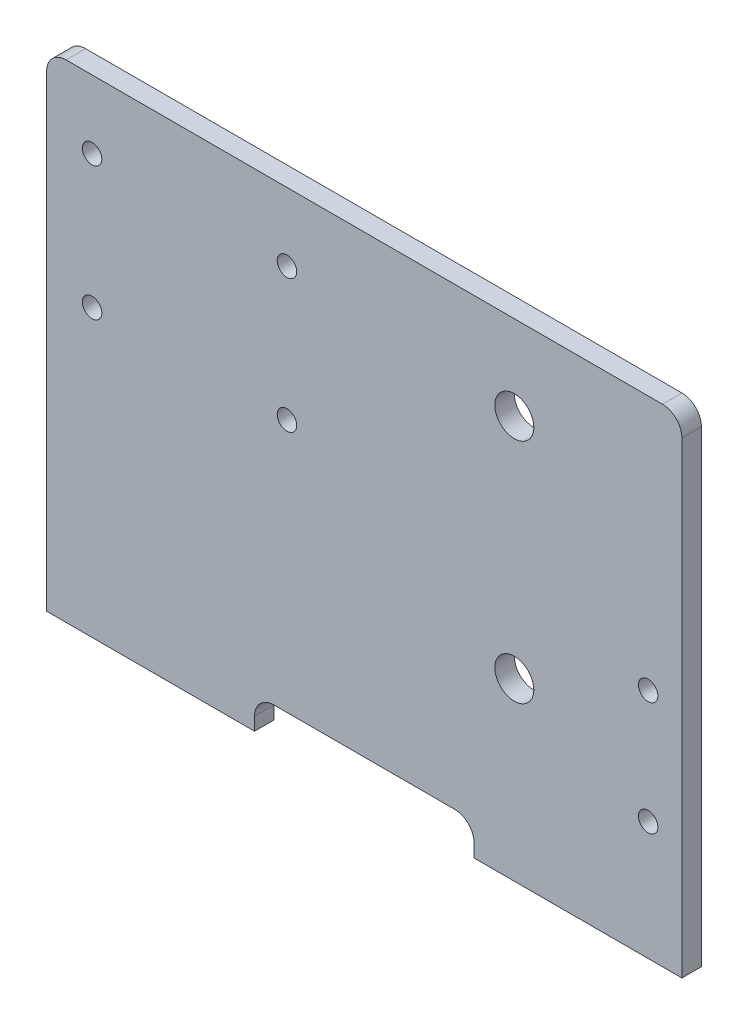
ISO-10303-21;
HEADER;
FILE_DESCRIPTION(('STEP AP214'),'2;1');
FILE_NAME('part.step','',(''),(''),'','','');
FILE_SCHEMA(('AUTOMOTIVE_DESIGN { 1 0 10303 214 1 1 1 1 }'));
ENDSEC;
DATA;
#1=APPLICATION_CONTEXT('core data for automotive mechanical design processes');
#2=APPLICATION_PROTOCOL_DEFINITION('international standard','automotive_design',2000,#1);
#3=PRODUCT_CONTEXT('',#1,'mechanical');
#4=PRODUCT('Part','Part','',(#3));
#5=PRODUCT_RELATED_PRODUCT_CATEGORY('part','',(#4));
#6=PRODUCT_DEFINITION_FORMATION('','',#4);
#7=PRODUCT_DEFINITION_CONTEXT('part definition',#1,'design');
#8=PRODUCT_DEFINITION('design','',#6,#7);
#9=PRODUCT_DEFINITION_SHAPE('','',#8);
#10=(LENGTH_UNIT() NAMED_UNIT(*) SI_UNIT(.MILLI.,.METRE.));
#11=(NAMED_UNIT(*) PLANE_ANGLE_UNIT() SI_UNIT($,.RADIAN.));
#12=(NAMED_UNIT(*) SI_UNIT($,.STERADIAN.) SOLID_ANGLE_UNIT());
#13=UNCERTAINTY_MEASURE_WITH_UNIT(LENGTH_MEASURE(1.E-05),#10,'distance_accuracy_value','');
#14=(GEOMETRIC_REPRESENTATION_CONTEXT(3) GLOBAL_UNCERTAINTY_ASSIGNED_CONTEXT((#13)) GLOBAL_UNIT_ASSIGNED_CONTEXT((#10,
#11,#12)) REPRESENTATION_CONTEXT('',''));
#15=CARTESIAN_POINT('',(0.,0.,0.));
#16=DIRECTION('',(0.,0.,1.));
#17=DIRECTION('',(1.,0.,0.));
#18=AXIS2_PLACEMENT_3D('',#15,#16,#17);
#19=CARTESIAN_POINT('',(-48.9,-37.5,1.5));
#20=DIRECTION('',(0.,1.,0.));
#21=DIRECTION('',(0.,0.,1.));
#22=AXIS2_PLACEMENT_3D('',#19,#20,#21);
#23=PLANE('',#22);
#24=DIRECTION('',(1.,0.,0.));
#25=VECTOR('',#24,1.);
#26=CARTESIAN_POINT('',(-48.9,-37.5,1.5));
#27=LINE('',#26,#25);
#28=CARTESIAN_POINT('',(16.9,-37.5,1.5));
#29=VERTEX_POINT('',#28);
#30=CARTESIAN_POINT('',(48.9,-37.5,1.5));
#31=VERTEX_POINT('',#30);
#32=EDGE_CURVE('E270',#29,#31,#27,.T.);
#33=ORIENTED_EDGE('',*,*,#32,.F.);
#34=DIRECTION('',(0.,0.,1.));
#35=VECTOR('',#34,1.);
#36=CARTESIAN_POINT('',(16.9,-37.5,-1.5));
#37=LINE('',#36,#35);
#38=CARTESIAN_POINT('',(16.9,-37.5,-1.5));
#39=VERTEX_POINT('',#38);
#40=EDGE_CURVE('E155',#39,#29,#37,.T.);
#41=ORIENTED_EDGE('',*,*,#40,.F.);
#42=DIRECTION('',(1.,0.,0.));
#43=VECTOR('',#42,1.);
#44=CARTESIAN_POINT('',(-48.9,-37.5,-1.5));
#45=LINE('',#44,#43);
#46=CARTESIAN_POINT('',(48.9,-37.5,-1.5));
#47=VERTEX_POINT('',#46);
#48=EDGE_CURVE('E162',#39,#47,#45,.T.);
#49=ORIENTED_EDGE('',*,*,#48,.T.);
#50=DIRECTION('',(0.,0.,-1.));
#51=VECTOR('',#50,1.);
#52=CARTESIAN_POINT('',(48.9,-37.5,1.5));
#53=LINE('',#52,#51);
#54=EDGE_CURVE('E170',#31,#47,#53,.T.);
#55=ORIENTED_EDGE('',*,*,#54,.F.);
#56=EDGE_LOOP('',(#33,#41,#49,#55));
#57=FACE_BOUND('',#56,.T.);
#58=ADVANCED_FACE('F45',(#57),#23,.F.);
#59=CARTESIAN_POINT('',(0.,0.,1.5));
#60=DIRECTION('',(0.,0.,1.));
#61=DIRECTION('',(1.,0.,0.));
#62=AXIS2_PLACEMENT_3D('',#59,#60,#61);
#63=PLANE('',#62);
#64=DIRECTION('',(-1.,0.,0.));
#65=VECTOR('',#64,1.);
#66=CARTESIAN_POINT('',(-48.9,37.5,1.5));
#67=LINE('',#66,#65);
#68=CARTESIAN_POINT('',(45.9,37.5,1.5));
#69=VERTEX_POINT('',#68);
#70=CARTESIAN_POINT('',(-45.9,37.5,1.5));
#71=VERTEX_POINT('',#70);
#72=EDGE_CURVE('E164',#69,#71,#67,.T.);
#73=ORIENTED_EDGE('',*,*,#72,.T.);
#74=CARTESIAN_POINT('',(-45.9,34.5,1.5));
#75=DIRECTION('',(0.,0.,1.));
#76=DIRECTION('',(1.,0.,0.));
#77=AXIS2_PLACEMENT_3D('',#74,#75,#76);
#78=CIRCLE('',#77,3.);
#79=CARTESIAN_POINT('',(-48.9,34.5,1.5));
#80=VERTEX_POINT('',#79);
#81=EDGE_CURVE('E196',#71,#80,#78,.T.);
#82=ORIENTED_EDGE('',*,*,#81,.T.);
#83=DIRECTION('',(0.,-1.,0.));
#84=VECTOR('',#83,1.);
#85=CARTESIAN_POINT('',(-48.9,37.5,1.5));
#86=LINE('',#85,#84);
#87=CARTESIAN_POINT('',(-48.9,-37.5,1.5));
#88=VERTEX_POINT('',#87);
#89=EDGE_CURVE('E268',#80,#88,#86,.T.);
#90=ORIENTED_EDGE('',*,*,#89,.T.);
#91=CARTESIAN_POINT('',(-16.9,-37.5,1.5));
#92=VERTEX_POINT('',#91);
#93=EDGE_CURVE('E173',#88,#92,#27,.T.);
#94=ORIENTED_EDGE('',*,*,#93,.T.);
#95=DIRECTION('',(0.,-1.,0.));
#96=VECTOR('',#95,1.);
#97=CARTESIAN_POINT('',(-16.9,-37.5,1.5));
#98=LINE('',#97,#96);
#99=CARTESIAN_POINT('',(-16.9,-35.5,1.5));
#100=VERTEX_POINT('',#99);
#101=EDGE_CURVE('E151',#100,#92,#98,.T.);
#102=ORIENTED_EDGE('',*,*,#101,.F.);
#103=CARTESIAN_POINT('',(-13.9,-35.5,1.5));
#104=DIRECTION('',(0.,0.,1.));
#105=DIRECTION('',(1.,0.,0.));
#106=AXIS2_PLACEMENT_3D('',#103,#104,#105);
#107=CIRCLE('',#106,3.);
#108=CARTESIAN_POINT('',(-13.9,-32.5,1.5));
#109=VERTEX_POINT('',#108);
#110=EDGE_CURVE('E53',#100,#109,#107,.F.);
#111=ORIENTED_EDGE('',*,*,#110,.T.);
#112=DIRECTION('',(-1.,0.,0.));
#113=VECTOR('',#112,1.);
#114=CARTESIAN_POINT('',(16.9,-32.5,1.5));
#115=LINE('',#114,#113);
#116=CARTESIAN_POINT('',(13.9,-32.5,1.5));
#117=VERTEX_POINT('',#116);
#118=EDGE_CURVE('E210',#117,#109,#115,.T.);
#119=ORIENTED_EDGE('',*,*,#118,.F.);
#120=CARTESIAN_POINT('',(13.9,-35.5,1.5));
#121=DIRECTION('',(0.,0.,1.));
#122=DIRECTION('',(1.,0.,0.));
#123=AXIS2_PLACEMENT_3D('',#120,#121,#122);
#124=CIRCLE('',#123,3.);
#125=CARTESIAN_POINT('',(16.9,-35.5,1.5));
#126=VERTEX_POINT('',#125);
#127=EDGE_CURVE('E201',#117,#126,#124,.F.);
#128=ORIENTED_EDGE('',*,*,#127,.T.);
#129=DIRECTION('',(0.,1.,0.));
#130=VECTOR('',#129,1.);
#131=CARTESIAN_POINT('',(16.9,-37.5,1.5));
#132=LINE('',#131,#130);
#133=EDGE_CURVE('E215',#29,#126,#132,.T.);
#134=ORIENTED_EDGE('',*,*,#133,.F.);
#135=ORIENTED_EDGE('',*,*,#32,.T.);
#136=DIRECTION('',(0.,1.,0.));
#137=VECTOR('',#136,1.);
#138=CARTESIAN_POINT('',(48.9,37.5,1.5));
#139=LINE('',#138,#137);
#140=CARTESIAN_POINT('',(48.9,34.5,1.5));
#141=VERTEX_POINT('',#140);
#142=EDGE_CURVE('E161',#31,#141,#139,.T.);
#143=ORIENTED_EDGE('',*,*,#142,.T.);
#144=CARTESIAN_POINT('',(45.9,34.5,1.5));
#145=DIRECTION('',(0.,0.,1.));
#146=DIRECTION('',(1.,0.,0.));
#147=AXIS2_PLACEMENT_3D('',#144,#145,#146);
#148=CIRCLE('',#147,3.);
#149=EDGE_CURVE('E194',#141,#69,#148,.T.);
#150=ORIENTED_EDGE('',*,*,#149,.T.);
#151=EDGE_LOOP('',(#73,#82,#90,#94,#102,#111,#119,#128,#134,#135,#143,#150));
#152=FACE_BOUND('',#151,.T.);
#153=CARTESIAN_POINT('',(43.7,-1.75,1.5));
#154=DIRECTION('',(0.,0.,1.));
#155=DIRECTION('',(1.,0.,0.));
#156=AXIS2_PLACEMENT_3D('',#153,#154,#155);
#157=CIRCLE('',#156,1.5);
#158=CARTESIAN_POINT('',(45.2,-1.75,1.5));
#159=VERTEX_POINT('',#158);
#160=EDGE_CURVE('E307',#159,#159,#157,.T.);
#161=ORIENTED_EDGE('',*,*,#160,.F.);
#162=EDGE_LOOP('',(#161));
#163=FACE_BOUND('',#162,.T.);
#164=CARTESIAN_POINT('',(-41.9,6.5,1.5));
#165=DIRECTION('',(0.,0.,1.));
#166=DIRECTION('',(1.,0.,0.));
#167=AXIS2_PLACEMENT_3D('',#164,#165,#166);
#168=CIRCLE('',#167,1.5);
#169=CARTESIAN_POINT('',(-40.4,6.5,1.5));
#170=VERTEX_POINT('',#169);
#171=EDGE_CURVE('E319',#170,#170,#168,.T.);
#172=ORIENTED_EDGE('',*,*,#171,.F.);
#173=EDGE_LOOP('',(#172));
#174=FACE_BOUND('',#173,.T.);
#175=CARTESIAN_POINT('',(-11.9,27.,1.5));
#176=DIRECTION('',(0.,0.,1.));
#177=DIRECTION('',(1.,0.,0.));
#178=AXIS2_PLACEMENT_3D('',#175,#176,#177);
#179=CIRCLE('',#178,1.5);
#180=CARTESIAN_POINT('',(-10.4,27.,1.5));
#181=VERTEX_POINT('',#180);
#182=EDGE_CURVE('E331',#181,#181,#179,.T.);
#183=ORIENTED_EDGE('',*,*,#182,.F.);
#184=EDGE_LOOP('',(#183));
#185=FACE_BOUND('',#184,.T.);
#186=CARTESIAN_POINT('',(-41.9,27.,1.5));
#187=DIRECTION('',(0.,0.,1.));
#188=DIRECTION('',(1.,0.,0.));
#189=AXIS2_PLACEMENT_3D('',#186,#187,#188);
#190=CIRCLE('',#189,1.5);
#191=CARTESIAN_POINT('',(-40.4,27.,1.5));
#192=VERTEX_POINT('',#191);
#193=EDGE_CURVE('E277',#192,#192,#190,.T.);
#194=ORIENTED_EDGE('',*,*,#193,.F.);
#195=EDGE_LOOP('',(#194));
#196=FACE_BOUND('',#195,.T.);
#197=CARTESIAN_POINT('',(23.1,-10.5,1.5));
#198=DIRECTION('',(0.,0.,1.));
#199=DIRECTION('',(1.,0.,0.));
#200=AXIS2_PLACEMENT_3D('',#197,#198,#199);
#201=CIRCLE('',#200,3.);
#202=CARTESIAN_POINT('',(26.1,-10.5,1.5));
#203=VERTEX_POINT('',#202);
#204=EDGE_CURVE('E337',#203,#203,#201,.T.);
#205=ORIENTED_EDGE('',*,*,#204,.F.);
#206=EDGE_LOOP('',(#205));
#207=FACE_BOUND('',#206,.T.);
#208=CARTESIAN_POINT('',(-11.8999999999998,6.5,1.5));
#209=DIRECTION('',(0.,0.,1.));
#210=DIRECTION('',(1.,0.,0.));
#211=AXIS2_PLACEMENT_3D('',#208,#209,#210);
#212=CIRCLE('',#211,1.5);
#213=CARTESIAN_POINT('',(-10.3999999999998,6.5,1.5));
#214=VERTEX_POINT('',#213);
#215=EDGE_CURVE('E325',#214,#214,#212,.T.);
#216=ORIENTED_EDGE('',*,*,#215,.F.);
#217=EDGE_LOOP('',(#216));
#218=FACE_BOUND('',#217,.T.);
#219=CARTESIAN_POINT('',(23.1,24.5,1.5));
#220=DIRECTION('',(0.,0.,1.));
#221=DIRECTION('',(1.,0.,0.));
#222=AXIS2_PLACEMENT_3D('',#219,#220,#221);
#223=CIRCLE('',#222,3.);
#224=CARTESIAN_POINT('',(26.1,24.5,1.5));
#225=VERTEX_POINT('',#224);
#226=EDGE_CURVE('E313',#225,#225,#223,.T.);
#227=ORIENTED_EDGE('',*,*,#226,.F.);
#228=EDGE_LOOP('',(#227));
#229=FACE_BOUND('',#228,.T.);
#230=CARTESIAN_POINT('',(43.7,-19.25,1.5));
#231=DIRECTION('',(0.,0.,1.));
#232=DIRECTION('',(1.,0.,0.));
#233=AXIS2_PLACEMENT_3D('',#230,#231,#232);
#234=CIRCLE('',#233,1.5);
#235=CARTESIAN_POINT('',(45.2,-19.25,1.5));
#236=VERTEX_POINT('',#235);
#237=EDGE_CURVE('E301',#236,#236,#234,.T.);
#238=ORIENTED_EDGE('',*,*,#237,.F.);
#239=EDGE_LOOP('',(#238));
#240=FACE_BOUND('',#239,.T.);
#241=ADVANCED_FACE('F208',(#152,#163,#174,#185,#196,#207,#218,#229,#240),#63,.T.);
#242=CARTESIAN_POINT('',(0.,0.,-1.5));
#243=DIRECTION('',(0.,0.,1.));
#244=DIRECTION('',(1.,0.,0.));
#245=AXIS2_PLACEMENT_3D('',#242,#243,#244);
#246=PLANE('',#245);
#247=DIRECTION('',(0.,-1.,0.));
#248=VECTOR('',#247,1.);
#249=CARTESIAN_POINT('',(-48.9,37.5,-1.5));
#250=LINE('',#249,#248);
#251=CARTESIAN_POINT('',(-48.9,34.5,-1.5));
#252=VERTEX_POINT('',#251);
#253=CARTESIAN_POINT('',(-48.9,-37.5,-1.5));
#254=VERTEX_POINT('',#253);
#255=EDGE_CURVE('E166',#252,#254,#250,.T.);
#256=ORIENTED_EDGE('',*,*,#255,.F.);
#257=CARTESIAN_POINT('',(-45.9,34.5,-1.5));
#258=DIRECTION('',(0.,0.,1.));
#259=DIRECTION('',(1.,0.,0.));
#260=AXIS2_PLACEMENT_3D('',#257,#258,#259);
#261=CIRCLE('',#260,3.);
#262=CARTESIAN_POINT('',(-45.9,37.5,-1.5));
#263=VERTEX_POINT('',#262);
#264=EDGE_CURVE('E187',#252,#263,#261,.F.);
#265=ORIENTED_EDGE('',*,*,#264,.T.);
#266=DIRECTION('',(-1.,0.,0.));
#267=VECTOR('',#266,1.);
#268=CARTESIAN_POINT('',(-48.9,37.5,-1.5));
#269=LINE('',#268,#267);
#270=CARTESIAN_POINT('',(45.9,37.5,-1.5));
#271=VERTEX_POINT('',#270);
#272=EDGE_CURVE('E276',#271,#263,#269,.T.);
#273=ORIENTED_EDGE('',*,*,#272,.F.);
#274=CARTESIAN_POINT('',(45.9,34.5,-1.5));
#275=DIRECTION('',(0.,0.,1.));
#276=DIRECTION('',(1.,0.,0.));
#277=AXIS2_PLACEMENT_3D('',#274,#275,#276);
#278=CIRCLE('',#277,3.);
#279=CARTESIAN_POINT('',(48.9,34.5,-1.5));
#280=VERTEX_POINT('',#279);
#281=EDGE_CURVE('E185',#271,#280,#278,.F.);
#282=ORIENTED_EDGE('',*,*,#281,.T.);
#283=DIRECTION('',(0.,1.,0.));
#284=VECTOR('',#283,1.);
#285=CARTESIAN_POINT('',(48.9,37.5,-1.5));
#286=LINE('',#285,#284);
#287=EDGE_CURVE('E275',#47,#280,#286,.T.);
#288=ORIENTED_EDGE('',*,*,#287,.F.);
#289=ORIENTED_EDGE('',*,*,#48,.F.);
#290=DIRECTION('',(0.,1.,0.));
#291=VECTOR('',#290,1.);
#292=CARTESIAN_POINT('',(16.9,-37.5,-1.5));
#293=LINE('',#292,#291);
#294=CARTESIAN_POINT('',(16.9,-35.5,-1.5));
#295=VERTEX_POINT('',#294);
#296=EDGE_CURVE('E289',#39,#295,#293,.T.);
#297=ORIENTED_EDGE('',*,*,#296,.T.);
#298=CARTESIAN_POINT('',(13.9,-35.5,-1.5));
#299=DIRECTION('',(0.,0.,1.));
#300=DIRECTION('',(1.,0.,0.));
#301=AXIS2_PLACEMENT_3D('',#298,#299,#300);
#302=CIRCLE('',#301,3.);
#303=CARTESIAN_POINT('',(13.9,-32.5,-1.5));
#304=VERTEX_POINT('',#303);
#305=EDGE_CURVE('E203',#295,#304,#302,.T.);
#306=ORIENTED_EDGE('',*,*,#305,.T.);
#307=DIRECTION('',(-1.,0.,0.));
#308=VECTOR('',#307,1.);
#309=CARTESIAN_POINT('',(16.9,-32.5,-1.5));
#310=LINE('',#309,#308);
#311=CARTESIAN_POINT('',(-13.9,-32.5,-1.5));
#312=VERTEX_POINT('',#311);
#313=EDGE_CURVE('E146',#304,#312,#310,.T.);
#314=ORIENTED_EDGE('',*,*,#313,.T.);
#315=CARTESIAN_POINT('',(-13.9,-35.5,-1.5));
#316=DIRECTION('',(0.,0.,1.));
#317=DIRECTION('',(1.,0.,0.));
#318=AXIS2_PLACEMENT_3D('',#315,#316,#317);
#319=CIRCLE('',#318,3.);
#320=CARTESIAN_POINT('',(-16.9,-35.5,-1.5));
#321=VERTEX_POINT('',#320);
#322=EDGE_CURVE('E11',#312,#321,#319,.T.);
#323=ORIENTED_EDGE('',*,*,#322,.T.);
#324=DIRECTION('',(0.,-1.,0.));
#325=VECTOR('',#324,1.);
#326=CARTESIAN_POINT('',(-16.9,-37.5,-1.5));
#327=LINE('',#326,#325);
#328=CARTESIAN_POINT('',(-16.9,-37.5,-1.5));
#329=VERTEX_POINT('',#328);
#330=EDGE_CURVE('E135',#321,#329,#327,.T.);
#331=ORIENTED_EDGE('',*,*,#330,.T.);
#332=EDGE_CURVE('E141',#254,#329,#45,.T.);
#333=ORIENTED_EDGE('',*,*,#332,.F.);
#334=EDGE_LOOP('',(#256,#265,#273,#282,#288,#289,#297,#306,#314,#323,#331,#333));
#335=FACE_BOUND('',#334,.T.);
#336=CARTESIAN_POINT('',(-41.9,27.,-1.5));
#337=DIRECTION('',(0.,0.,1.));
#338=DIRECTION('',(1.,0.,0.));
#339=AXIS2_PLACEMENT_3D('',#336,#337,#338);
#340=CIRCLE('',#339,1.5);
#341=CARTESIAN_POINT('',(-40.4,27.,-1.5));
#342=VERTEX_POINT('',#341);
#343=EDGE_CURVE('E340',#342,#342,#340,.T.);
#344=ORIENTED_EDGE('',*,*,#343,.T.);
#345=EDGE_LOOP('',(#344));
#346=FACE_BOUND('',#345,.T.);
#347=CARTESIAN_POINT('',(23.1,-10.5,-1.5));
#348=DIRECTION('',(0.,0.,1.));
#349=DIRECTION('',(1.,0.,0.));
#350=AXIS2_PLACEMENT_3D('',#347,#348,#349);
#351=CIRCLE('',#350,3.);
#352=CARTESIAN_POINT('',(26.1,-10.5,-1.5));
#353=VERTEX_POINT('',#352);
#354=EDGE_CURVE('E334',#353,#353,#351,.T.);
#355=ORIENTED_EDGE('',*,*,#354,.T.);
#356=EDGE_LOOP('',(#355));
#357=FACE_BOUND('',#356,.T.);
#358=CARTESIAN_POINT('',(-11.9,27.,-1.5));
#359=DIRECTION('',(0.,0.,1.));
#360=DIRECTION('',(1.,0.,0.));
#361=AXIS2_PLACEMENT_3D('',#358,#359,#360);
#362=CIRCLE('',#361,1.5);
#363=CARTESIAN_POINT('',(-10.4,27.,-1.5));
#364=VERTEX_POINT('',#363);
#365=EDGE_CURVE('E328',#364,#364,#362,.T.);
#366=ORIENTED_EDGE('',*,*,#365,.T.);
#367=EDGE_LOOP('',(#366));
#368=FACE_BOUND('',#367,.T.);
#369=CARTESIAN_POINT('',(-11.8999999999998,6.5,-1.5));
#370=DIRECTION('',(0.,0.,1.));
#371=DIRECTION('',(1.,0.,0.));
#372=AXIS2_PLACEMENT_3D('',#369,#370,#371);
#373=CIRCLE('',#372,1.5);
#374=CARTESIAN_POINT('',(-10.3999999999998,6.5,-1.5));
#375=VERTEX_POINT('',#374);
#376=EDGE_CURVE('E322',#375,#375,#373,.T.);
#377=ORIENTED_EDGE('',*,*,#376,.T.);
#378=EDGE_LOOP('',(#377));
#379=FACE_BOUND('',#378,.T.);
#380=CARTESIAN_POINT('',(-41.9,6.5,-1.5));
#381=DIRECTION('',(0.,0.,1.));
#382=DIRECTION('',(1.,0.,0.));
#383=AXIS2_PLACEMENT_3D('',#380,#381,#382);
#384=CIRCLE('',#383,1.5);
#385=CARTESIAN_POINT('',(-40.4,6.5,-1.5));
#386=VERTEX_POINT('',#385);
#387=EDGE_CURVE('E316',#386,#386,#384,.T.);
#388=ORIENTED_EDGE('',*,*,#387,.T.);
#389=EDGE_LOOP('',(#388));
#390=FACE_BOUND('',#389,.T.);
#391=CARTESIAN_POINT('',(23.1,24.5,-1.5));
#392=DIRECTION('',(0.,0.,1.));
#393=DIRECTION('',(1.,0.,0.));
#394=AXIS2_PLACEMENT_3D('',#391,#392,#393);
#395=CIRCLE('',#394,3.);
#396=CARTESIAN_POINT('',(26.1,24.5,-1.5));
#397=VERTEX_POINT('',#396);
#398=EDGE_CURVE('E310',#397,#397,#395,.T.);
#399=ORIENTED_EDGE('',*,*,#398,.T.);
#400=EDGE_LOOP('',(#399));
#401=FACE_BOUND('',#400,.T.);
#402=CARTESIAN_POINT('',(43.7,-1.75,-1.5));
#403=DIRECTION('',(0.,0.,1.));
#404=DIRECTION('',(1.,0.,0.));
#405=AXIS2_PLACEMENT_3D('',#402,#403,#404);
#406=CIRCLE('',#405,1.5);
#407=CARTESIAN_POINT('',(45.2,-1.75,-1.5));
#408=VERTEX_POINT('',#407);
#409=EDGE_CURVE('E304',#408,#408,#406,.T.);
#410=ORIENTED_EDGE('',*,*,#409,.T.);
#411=EDGE_LOOP('',(#410));
#412=FACE_BOUND('',#411,.T.);
#413=CARTESIAN_POINT('',(43.7,-19.25,-1.5));
#414=DIRECTION('',(0.,0.,1.));
#415=DIRECTION('',(1.,0.,0.));
#416=AXIS2_PLACEMENT_3D('',#413,#414,#415);
#417=CIRCLE('',#416,1.5);
#418=CARTESIAN_POINT('',(45.2,-19.25,-1.5));
#419=VERTEX_POINT('',#418);
#420=EDGE_CURVE('E299',#419,#419,#417,.T.);
#421=ORIENTED_EDGE('',*,*,#420,.T.);
#422=EDGE_LOOP('',(#421));
#423=FACE_BOUND('',#422,.T.);
#424=ADVANCED_FACE('F138',(#335,#346,#357,#368,#379,#390,#401,#412,#423),#246,.F.);
#425=CARTESIAN_POINT('',(48.9,37.5,1.5));
#426=DIRECTION('',(-1.,0.,0.));
#427=DIRECTION('',(0.,0.,1.));
#428=AXIS2_PLACEMENT_3D('',#425,#426,#427);
#429=PLANE('',#428);
#430=ORIENTED_EDGE('',*,*,#287,.T.);
#431=DIRECTION('',(0.,0.,-1.));
#432=VECTOR('',#431,1.);
#433=CARTESIAN_POINT('',(48.9,34.5,1.5));
#434=LINE('',#433,#432);
#435=EDGE_CURVE('E67',#280,#141,#434,.F.);
#436=ORIENTED_EDGE('',*,*,#435,.T.);
#437=ORIENTED_EDGE('',*,*,#142,.F.);
#438=ORIENTED_EDGE('',*,*,#54,.T.);
#439=EDGE_LOOP('',(#430,#436,#437,#438));
#440=FACE_BOUND('',#439,.T.);
#441=ADVANCED_FACE('F251',(#440),#429,.F.);
#442=CARTESIAN_POINT('',(-48.9,37.5,1.5));
#443=DIRECTION('',(0.,-1.,0.));
#444=DIRECTION('',(0.,0.,-1.));
#445=AXIS2_PLACEMENT_3D('',#442,#443,#444);
#446=PLANE('',#445);
#447=ORIENTED_EDGE('',*,*,#272,.T.);
#448=DIRECTION('',(0.,0.,-1.));
#449=VECTOR('',#448,1.);
#450=CARTESIAN_POINT('',(-45.9,37.5,1.5));
#451=LINE('',#450,#449);
#452=EDGE_CURVE('E192',#263,#71,#451,.F.);
#453=ORIENTED_EDGE('',*,*,#452,.T.);
#454=ORIENTED_EDGE('',*,*,#72,.F.);
#455=DIRECTION('',(0.,0.,-1.));
#456=VECTOR('',#455,1.);
#457=CARTESIAN_POINT('',(45.9,37.5,1.5));
#458=LINE('',#457,#456);
#459=EDGE_CURVE('E189',#69,#271,#458,.T.);
#460=ORIENTED_EDGE('',*,*,#459,.T.);
#461=EDGE_LOOP('',(#447,#453,#454,#460));
#462=FACE_BOUND('',#461,.T.);
#463=ADVANCED_FACE('F246',(#462),#446,.F.);
#464=CARTESIAN_POINT('',(-48.9,37.5,1.5));
#465=DIRECTION('',(1.,0.,0.));
#466=DIRECTION('',(0.,0.,-1.));
#467=AXIS2_PLACEMENT_3D('',#464,#465,#466);
#468=PLANE('',#467);
#469=ORIENTED_EDGE('',*,*,#89,.F.);
#470=DIRECTION('',(0.,0.,-1.));
#471=VECTOR('',#470,1.);
#472=CARTESIAN_POINT('',(-48.9,34.5,1.5));
#473=LINE('',#472,#471);
#474=EDGE_CURVE('E182',#80,#252,#473,.T.);
#475=ORIENTED_EDGE('',*,*,#474,.T.);
#476=ORIENTED_EDGE('',*,*,#255,.T.);
#477=DIRECTION('',(0.,0.,-1.));
#478=VECTOR('',#477,1.);
#479=CARTESIAN_POINT('',(-48.9,-37.5,1.5));
#480=LINE('',#479,#478);
#481=EDGE_CURVE('E160',#88,#254,#480,.T.);
#482=ORIENTED_EDGE('',*,*,#481,.F.);
#483=EDGE_LOOP('',(#469,#475,#476,#482));
#484=FACE_BOUND('',#483,.T.);
#485=ADVANCED_FACE('F237',(#484),#468,.F.);
#486=ORIENTED_EDGE('',*,*,#332,.T.);
#487=DIRECTION('',(0.,0.,1.));
#488=VECTOR('',#487,1.);
#489=CARTESIAN_POINT('',(-16.9,-37.5,-1.5));
#490=LINE('',#489,#488);
#491=EDGE_CURVE('E145',#329,#92,#490,.T.);
#492=ORIENTED_EDGE('',*,*,#491,.T.);
#493=ORIENTED_EDGE('',*,*,#93,.F.);
#494=ORIENTED_EDGE('',*,*,#481,.T.);
#495=EDGE_LOOP('',(#486,#492,#493,#494));
#496=FACE_BOUND('',#495,.T.);
#497=ADVANCED_FACE('F158',(#496),#23,.F.);
#498=CARTESIAN_POINT('',(-41.9,27.,1.5));
#499=DIRECTION('',(0.,0.,-1.));
#500=DIRECTION('',(-1.,0.,0.));
#501=AXIS2_PLACEMENT_3D('',#498,#499,#500);
#502=CYLINDRICAL_SURFACE('',#501,1.5);
#503=ORIENTED_EDGE('',*,*,#193,.T.);
#504=EDGE_LOOP('',(#503));
#505=FACE_BOUND('',#504,.T.);
#506=ORIENTED_EDGE('',*,*,#343,.F.);
#507=EDGE_LOOP('',(#506));
#508=FACE_BOUND('',#507,.T.);
#509=ADVANCED_FACE('F236',(#505,#508),#502,.F.);
#510=CARTESIAN_POINT('',(23.1,-10.5,1.5));
#511=DIRECTION('',(0.,0.,-1.));
#512=DIRECTION('',(-1.,0.,0.));
#513=AXIS2_PLACEMENT_3D('',#510,#511,#512);
#514=CYLINDRICAL_SURFACE('',#513,3.);
#515=ORIENTED_EDGE('',*,*,#204,.T.);
#516=EDGE_LOOP('',(#515));
#517=FACE_BOUND('',#516,.T.);
#518=ORIENTED_EDGE('',*,*,#354,.F.);
#519=EDGE_LOOP('',(#518));
#520=FACE_BOUND('',#519,.T.);
#521=ADVANCED_FACE('F243',(#517,#520),#514,.F.);
#522=CARTESIAN_POINT('',(-11.9,27.,1.5));
#523=DIRECTION('',(0.,0.,-1.));
#524=DIRECTION('',(-1.,0.,0.));
#525=AXIS2_PLACEMENT_3D('',#522,#523,#524);
#526=CYLINDRICAL_SURFACE('',#525,1.5);
#527=ORIENTED_EDGE('',*,*,#182,.T.);
#528=EDGE_LOOP('',(#527));
#529=FACE_BOUND('',#528,.T.);
#530=ORIENTED_EDGE('',*,*,#365,.F.);
#531=EDGE_LOOP('',(#530));
#532=FACE_BOUND('',#531,.T.);
#533=ADVANCED_FACE('F389',(#529,#532),#526,.F.);
#534=CARTESIAN_POINT('',(-11.8999999999998,6.5,1.5));
#535=DIRECTION('',(0.,0.,-1.));
#536=DIRECTION('',(-1.,0.,0.));
#537=AXIS2_PLACEMENT_3D('',#534,#535,#536);
#538=CYLINDRICAL_SURFACE('',#537,1.5);
#539=ORIENTED_EDGE('',*,*,#215,.T.);
#540=EDGE_LOOP('',(#539));
#541=FACE_BOUND('',#540,.T.);
#542=ORIENTED_EDGE('',*,*,#376,.F.);
#543=EDGE_LOOP('',(#542));
#544=FACE_BOUND('',#543,.T.);
#545=ADVANCED_FACE('F385',(#541,#544),#538,.F.);
#546=CARTESIAN_POINT('',(-41.9,6.5,1.5));
#547=DIRECTION('',(0.,0.,-1.));
#548=DIRECTION('',(-1.,0.,0.));
#549=AXIS2_PLACEMENT_3D('',#546,#547,#548);
#550=CYLINDRICAL_SURFACE('',#549,1.5);
#551=ORIENTED_EDGE('',*,*,#171,.T.);
#552=EDGE_LOOP('',(#551));
#553=FACE_BOUND('',#552,.T.);
#554=ORIENTED_EDGE('',*,*,#387,.F.);
#555=EDGE_LOOP('',(#554));
#556=FACE_BOUND('',#555,.T.);
#557=ADVANCED_FACE('F381',(#553,#556),#550,.F.);
#558=CARTESIAN_POINT('',(23.1,24.5,1.5));
#559=DIRECTION('',(0.,0.,-1.));
#560=DIRECTION('',(-1.,0.,0.));
#561=AXIS2_PLACEMENT_3D('',#558,#559,#560);
#562=CYLINDRICAL_SURFACE('',#561,3.);
#563=ORIENTED_EDGE('',*,*,#226,.T.);
#564=EDGE_LOOP('',(#563));
#565=FACE_BOUND('',#564,.T.);
#566=ORIENTED_EDGE('',*,*,#398,.F.);
#567=EDGE_LOOP('',(#566));
#568=FACE_BOUND('',#567,.T.);
#569=ADVANCED_FACE('F374',(#565,#568),#562,.F.);
#570=CARTESIAN_POINT('',(43.7,-1.75,1.5));
#571=DIRECTION('',(0.,0.,-1.));
#572=DIRECTION('',(-1.,0.,0.));
#573=AXIS2_PLACEMENT_3D('',#570,#571,#572);
#574=CYLINDRICAL_SURFACE('',#573,1.5);
#575=ORIENTED_EDGE('',*,*,#160,.T.);
#576=EDGE_LOOP('',(#575));
#577=FACE_BOUND('',#576,.T.);
#578=ORIENTED_EDGE('',*,*,#409,.F.);
#579=EDGE_LOOP('',(#578));
#580=FACE_BOUND('',#579,.T.);
#581=ADVANCED_FACE('F366',(#577,#580),#574,.F.);
#582=CARTESIAN_POINT('',(43.7,-19.25,1.5));
#583=DIRECTION('',(0.,0.,-1.));
#584=DIRECTION('',(-1.,0.,0.));
#585=AXIS2_PLACEMENT_3D('',#582,#583,#584);
#586=CYLINDRICAL_SURFACE('',#585,1.5);
#587=ORIENTED_EDGE('',*,*,#237,.T.);
#588=EDGE_LOOP('',(#587));
#589=FACE_BOUND('',#588,.T.);
#590=ORIENTED_EDGE('',*,*,#420,.F.);
#591=EDGE_LOOP('',(#590));
#592=FACE_BOUND('',#591,.T.);
#593=ADVANCED_FACE('F364',(#589,#592),#586,.F.);
#594=CARTESIAN_POINT('',(16.9,-37.5,-1.5));
#595=DIRECTION('',(1.,0.,0.));
#596=DIRECTION('',(0.,0.,-1.));
#597=AXIS2_PLACEMENT_3D('',#594,#595,#596);
#598=PLANE('',#597);
#599=ORIENTED_EDGE('',*,*,#133,.T.);
#600=DIRECTION('',(0.,0.,1.));
#601=VECTOR('',#600,1.);
#602=CARTESIAN_POINT('',(16.9,-35.5,-1.5));
#603=LINE('',#602,#601);
#604=EDGE_CURVE('E180',#126,#295,#603,.F.);
#605=ORIENTED_EDGE('',*,*,#604,.T.);
#606=ORIENTED_EDGE('',*,*,#296,.F.);
#607=ORIENTED_EDGE('',*,*,#40,.T.);
#608=EDGE_LOOP('',(#599,#605,#606,#607));
#609=FACE_BOUND('',#608,.T.);
#610=ADVANCED_FACE('F294',(#609),#598,.F.);
#611=CARTESIAN_POINT('',(-16.9,-37.5,-1.5));
#612=DIRECTION('',(-1.,0.,0.));
#613=DIRECTION('',(0.,0.,1.));
#614=AXIS2_PLACEMENT_3D('',#611,#612,#613);
#615=PLANE('',#614);
#616=ORIENTED_EDGE('',*,*,#330,.F.);
#617=DIRECTION('',(0.,0.,1.));
#618=VECTOR('',#617,1.);
#619=CARTESIAN_POINT('',(-16.9,-35.5,1.5));
#620=LINE('',#619,#618);
#621=EDGE_CURVE('E199',#321,#100,#620,.T.);
#622=ORIENTED_EDGE('',*,*,#621,.T.);
#623=ORIENTED_EDGE('',*,*,#101,.T.);
#624=ORIENTED_EDGE('',*,*,#491,.F.);
#625=EDGE_LOOP('',(#616,#622,#623,#624));
#626=FACE_BOUND('',#625,.T.);
#627=ADVANCED_FACE('F149',(#626),#615,.F.);
#628=CARTESIAN_POINT('',(16.9,-32.5,-1.5));
#629=DIRECTION('',(0.,1.,0.));
#630=DIRECTION('',(0.,0.,1.));
#631=AXIS2_PLACEMENT_3D('',#628,#629,#630);
#632=PLANE('',#631);
#633=ORIENTED_EDGE('',*,*,#313,.F.);
#634=DIRECTION('',(0.,0.,1.));
#635=VECTOR('',#634,1.);
#636=CARTESIAN_POINT('',(13.9,-32.5,1.5));
#637=LINE('',#636,#635);
#638=EDGE_CURVE('E177',#304,#117,#637,.T.);
#639=ORIENTED_EDGE('',*,*,#638,.T.);
#640=ORIENTED_EDGE('',*,*,#118,.T.);
#641=DIRECTION('',(0.,0.,1.));
#642=VECTOR('',#641,1.);
#643=CARTESIAN_POINT('',(-13.9,-32.5,-1.5));
#644=LINE('',#643,#642);
#645=EDGE_CURVE('E175',#109,#312,#644,.F.);
#646=ORIENTED_EDGE('',*,*,#645,.T.);
#647=EDGE_LOOP('',(#633,#639,#640,#646));
#648=FACE_BOUND('',#647,.T.);
#649=ADVANCED_FACE('F213',(#648),#632,.F.);
#650=CARTESIAN_POINT('',(13.9,-35.5,-1.5));
#651=DIRECTION('',(0.,0.,-1.));
#652=DIRECTION('',(-1.,0.,0.));
#653=AXIS2_PLACEMENT_3D('',#650,#651,#652);
#654=CYLINDRICAL_SURFACE('',#653,3.);
#655=ORIENTED_EDGE('',*,*,#305,.F.);
#656=ORIENTED_EDGE('',*,*,#604,.F.);
#657=ORIENTED_EDGE('',*,*,#127,.F.);
#658=ORIENTED_EDGE('',*,*,#638,.F.);
#659=EDGE_LOOP('',(#655,#656,#657,#658));
#660=FACE_BOUND('',#659,.T.);
#661=ADVANCED_FACE('F257',(#660),#654,.F.);
#662=CARTESIAN_POINT('',(-45.9,34.5,1.5));
#663=DIRECTION('',(0.,0.,-1.));
#664=DIRECTION('',(-1.,0.,0.));
#665=AXIS2_PLACEMENT_3D('',#662,#663,#664);
#666=CYLINDRICAL_SURFACE('',#665,3.);
#667=ORIENTED_EDGE('',*,*,#81,.F.);
#668=ORIENTED_EDGE('',*,*,#452,.F.);
#669=ORIENTED_EDGE('',*,*,#264,.F.);
#670=ORIENTED_EDGE('',*,*,#474,.F.);
#671=EDGE_LOOP('',(#667,#668,#669,#670));
#672=FACE_BOUND('',#671,.T.);
#673=ADVANCED_FACE('F222',(#672),#666,.T.);
#674=CARTESIAN_POINT('',(45.9,34.5,1.5));
#675=DIRECTION('',(0.,0.,-1.));
#676=DIRECTION('',(-1.,0.,0.));
#677=AXIS2_PLACEMENT_3D('',#674,#675,#676);
#678=CYLINDRICAL_SURFACE('',#677,3.);
#679=ORIENTED_EDGE('',*,*,#149,.F.);
#680=ORIENTED_EDGE('',*,*,#435,.F.);
#681=ORIENTED_EDGE('',*,*,#281,.F.);
#682=ORIENTED_EDGE('',*,*,#459,.F.);
#683=EDGE_LOOP('',(#679,#680,#681,#682));
#684=FACE_BOUND('',#683,.T.);
#685=ADVANCED_FACE('F218',(#684),#678,.T.);
#686=CARTESIAN_POINT('',(-13.9,-35.5,-1.5));
#687=DIRECTION('',(0.,0.,-1.));
#688=DIRECTION('',(-1.,0.,0.));
#689=AXIS2_PLACEMENT_3D('',#686,#687,#688);
#690=CYLINDRICAL_SURFACE('',#689,3.);
#691=ORIENTED_EDGE('',*,*,#322,.F.);
#692=ORIENTED_EDGE('',*,*,#645,.F.);
#693=ORIENTED_EDGE('',*,*,#110,.F.);
#694=ORIENTED_EDGE('',*,*,#621,.F.);
#695=EDGE_LOOP('',(#691,#692,#693,#694));
#696=FACE_BOUND('',#695,.T.);
#697=ADVANCED_FACE('F47',(#696),#690,.F.);
#698=CLOSED_SHELL('',(#58,#241,#424,#441,#463,#485,#497,#509,#521,#533,#545,#557,#569,#581,#593,
#610,#627,#649,#661,#673,#685,#697));
#699=MANIFOLD_SOLID_BREP('B2',#698);
#700=ADVANCED_BREP_SHAPE_REPRESENTATION('',(#18,#699),#14);
#701=SHAPE_DEFINITION_REPRESENTATION(#9,#700);
ENDSEC;
END-ISO-10303-21;
